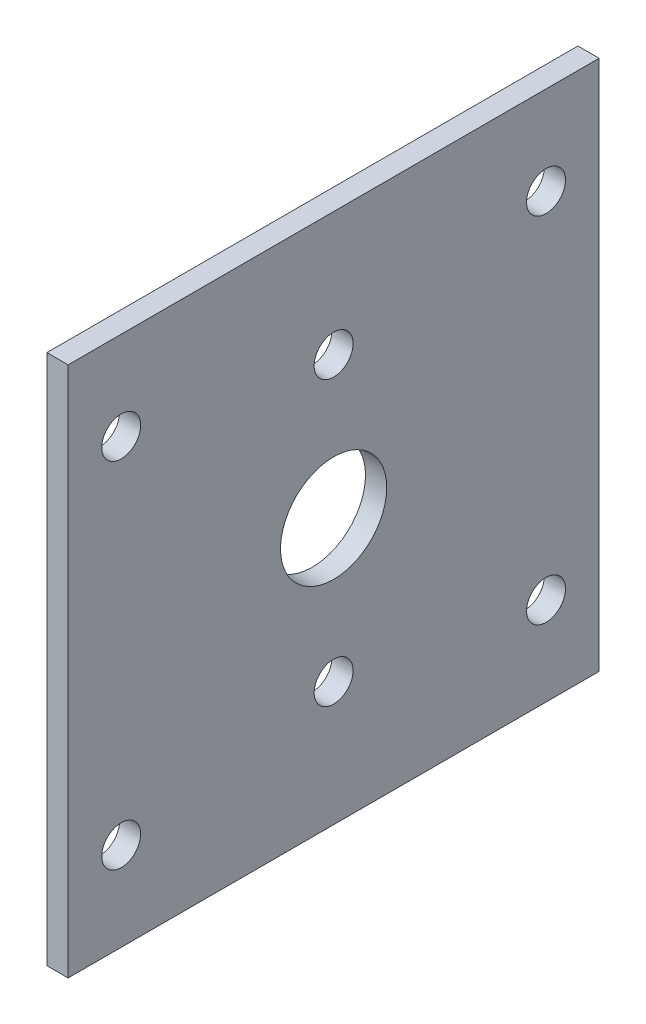
ISO-10303-21;
HEADER;
FILE_DESCRIPTION(('STEP AP214'),'2;1');
FILE_NAME('part.step','',(''),(''),'','','');
FILE_SCHEMA(('AUTOMOTIVE_DESIGN { 1 0 10303 214 1 1 1 1 }'));
ENDSEC;
DATA;
#1=APPLICATION_CONTEXT('core data for automotive mechanical design processes');
#2=APPLICATION_PROTOCOL_DEFINITION('international standard','automotive_design',2000,#1);
#3=PRODUCT_CONTEXT('',#1,'mechanical');
#4=PRODUCT('Part','Part','',(#3));
#5=PRODUCT_RELATED_PRODUCT_CATEGORY('part','',(#4));
#6=PRODUCT_DEFINITION_FORMATION('','',#4);
#7=PRODUCT_DEFINITION_CONTEXT('part definition',#1,'design');
#8=PRODUCT_DEFINITION('design','',#6,#7);
#9=PRODUCT_DEFINITION_SHAPE('','',#8);
#10=(LENGTH_UNIT() NAMED_UNIT(*) SI_UNIT(.MILLI.,.METRE.));
#11=(NAMED_UNIT(*) PLANE_ANGLE_UNIT() SI_UNIT($,.RADIAN.));
#12=(NAMED_UNIT(*) SI_UNIT($,.STERADIAN.) SOLID_ANGLE_UNIT());
#13=UNCERTAINTY_MEASURE_WITH_UNIT(LENGTH_MEASURE(1.E-05),#10,'distance_accuracy_value','');
#14=(GEOMETRIC_REPRESENTATION_CONTEXT(3) GLOBAL_UNCERTAINTY_ASSIGNED_CONTEXT((#13)) GLOBAL_UNIT_ASSIGNED_CONTEXT((#10,
#11,#12)) REPRESENTATION_CONTEXT('',''));
#15=CARTESIAN_POINT('',(0.,0.,0.));
#16=DIRECTION('',(0.,0.,1.));
#17=DIRECTION('',(1.,0.,0.));
#18=AXIS2_PLACEMENT_3D('',#15,#16,#17);
#19=CARTESIAN_POINT('',(3.,0.,0.));
#20=DIRECTION('',(-1.,0.,0.));
#21=DIRECTION('',(0.,0.,1.));
#22=AXIS2_PLACEMENT_3D('',#19,#20,#21);
#23=PLANE('',#22);
#24=DIRECTION('',(0.,1.,0.));
#25=VECTOR('',#24,1.);
#26=CARTESIAN_POINT('',(3.,107.5,-87.4999999999999));
#27=LINE('',#26,#25);
#28=CARTESIAN_POINT('',(3.,107.5,-87.4999999999999));
#29=VERTEX_POINT('',#28);
#30=CARTESIAN_POINT('',(3.,182.5,-87.4999999999999));
#31=VERTEX_POINT('',#30);
#32=EDGE_CURVE('E89',#29,#31,#27,.T.);
#33=ORIENTED_EDGE('',*,*,#32,.T.);
#34=DIRECTION('',(0.,0.,1.));
#35=VECTOR('',#34,1.);
#36=CARTESIAN_POINT('',(3.,182.5,-12.4999999999999));
#37=LINE('',#36,#35);
#38=CARTESIAN_POINT('',(3.,182.5,-12.4999999999999));
#39=VERTEX_POINT('',#38);
#40=EDGE_CURVE('E84',#31,#39,#37,.T.);
#41=ORIENTED_EDGE('',*,*,#40,.T.);
#42=DIRECTION('',(0.,-1.,0.));
#43=VECTOR('',#42,1.);
#44=CARTESIAN_POINT('',(3.,107.5,-12.4999999999999));
#45=LINE('',#44,#43);
#46=CARTESIAN_POINT('',(3.,107.5,-12.4999999999999));
#47=VERTEX_POINT('',#46);
#48=EDGE_CURVE('E87',#39,#47,#45,.T.);
#49=ORIENTED_EDGE('',*,*,#48,.T.);
#50=DIRECTION('',(0.,0.,-1.));
#51=VECTOR('',#50,1.);
#52=CARTESIAN_POINT('',(3.,107.5,-12.4999999999999));
#53=LINE('',#52,#51);
#54=EDGE_CURVE('E54',#47,#29,#53,.T.);
#55=ORIENTED_EDGE('',*,*,#54,.T.);
#56=EDGE_LOOP('',(#33,#41,#49,#55));
#57=FACE_BOUND('',#56,.T.);
#58=CARTESIAN_POINT('',(3.,145.,-50.));
#59=DIRECTION('',(1.,0.,0.));
#60=DIRECTION('',(0.,0.,-1.));
#61=AXIS2_PLACEMENT_3D('',#58,#59,#60);
#62=CIRCLE('',#61,7.5);
#63=CARTESIAN_POINT('',(3.,145.,-57.5));
#64=VERTEX_POINT('',#63);
#65=EDGE_CURVE('E104',#64,#64,#62,.T.);
#66=ORIENTED_EDGE('',*,*,#65,.F.);
#67=EDGE_LOOP('',(#66));
#68=FACE_BOUND('',#67,.T.);
#69=CARTESIAN_POINT('',(3.,165.,-50.));
#70=DIRECTION('',(1.,0.,0.));
#71=DIRECTION('',(0.,0.,-1.));
#72=AXIS2_PLACEMENT_3D('',#69,#70,#71);
#73=CIRCLE('',#72,2.75);
#74=CARTESIAN_POINT('',(3.,165.,-52.75));
#75=VERTEX_POINT('',#74);
#76=EDGE_CURVE('E119',#75,#75,#73,.T.);
#77=ORIENTED_EDGE('',*,*,#76,.F.);
#78=EDGE_LOOP('',(#77));
#79=FACE_BOUND('',#78,.T.);
#80=CARTESIAN_POINT('',(3.,170.,-19.9999999999999));
#81=DIRECTION('',(1.,0.,0.));
#82=DIRECTION('',(0.,0.,-1.));
#83=AXIS2_PLACEMENT_3D('',#80,#81,#82);
#84=CIRCLE('',#83,2.75000000000001);
#85=CARTESIAN_POINT('',(3.,170.,-22.75));
#86=VERTEX_POINT('',#85);
#87=EDGE_CURVE('E125',#86,#86,#84,.T.);
#88=ORIENTED_EDGE('',*,*,#87,.F.);
#89=EDGE_LOOP('',(#88));
#90=FACE_BOUND('',#89,.T.);
#91=CARTESIAN_POINT('',(3.,170.,-80.));
#92=DIRECTION('',(1.,0.,0.));
#93=DIRECTION('',(0.,0.,-1.));
#94=AXIS2_PLACEMENT_3D('',#91,#92,#93);
#95=CIRCLE('',#94,2.75);
#96=CARTESIAN_POINT('',(3.,170.,-82.75));
#97=VERTEX_POINT('',#96);
#98=EDGE_CURVE('E131',#97,#97,#95,.T.);
#99=ORIENTED_EDGE('',*,*,#98,.F.);
#100=EDGE_LOOP('',(#99));
#101=FACE_BOUND('',#100,.T.);
#102=CARTESIAN_POINT('',(3.,120.,-80.));
#103=DIRECTION('',(1.,0.,0.));
#104=DIRECTION('',(0.,0.,-1.));
#105=AXIS2_PLACEMENT_3D('',#102,#103,#104);
#106=CIRCLE('',#105,2.75000000000001);
#107=CARTESIAN_POINT('',(3.,120.,-82.75));
#108=VERTEX_POINT('',#107);
#109=EDGE_CURVE('E137',#108,#108,#106,.T.);
#110=ORIENTED_EDGE('',*,*,#109,.F.);
#111=EDGE_LOOP('',(#110));
#112=FACE_BOUND('',#111,.T.);
#113=CARTESIAN_POINT('',(3.,120.,-19.9999999999999));
#114=DIRECTION('',(1.,0.,0.));
#115=DIRECTION('',(0.,0.,-1.));
#116=AXIS2_PLACEMENT_3D('',#113,#114,#115);
#117=CIRCLE('',#116,2.75);
#118=CARTESIAN_POINT('',(3.,120.,-22.7499999999999));
#119=VERTEX_POINT('',#118);
#120=EDGE_CURVE('E143',#119,#119,#117,.T.);
#121=ORIENTED_EDGE('',*,*,#120,.F.);
#122=EDGE_LOOP('',(#121));
#123=FACE_BOUND('',#122,.T.);
#124=CARTESIAN_POINT('',(3.,125.,-50.));
#125=DIRECTION('',(1.,0.,0.));
#126=DIRECTION('',(0.,0.,-1.));
#127=AXIS2_PLACEMENT_3D('',#124,#125,#126);
#128=CIRCLE('',#127,2.75);
#129=CARTESIAN_POINT('',(3.,125.,-52.75));
#130=VERTEX_POINT('',#129);
#131=EDGE_CURVE('E149',#130,#130,#128,.T.);
#132=ORIENTED_EDGE('',*,*,#131,.F.);
#133=EDGE_LOOP('',(#132));
#134=FACE_BOUND('',#133,.T.);
#135=ADVANCED_FACE('F37',(#57,#68,#79,#90,#101,#112,#123,#134),#23,.F.);
#136=CARTESIAN_POINT('',(0.,0.,0.));
#137=DIRECTION('',(-1.,0.,0.));
#138=DIRECTION('',(0.,0.,1.));
#139=AXIS2_PLACEMENT_3D('',#136,#137,#138);
#140=PLANE('',#139);
#141=CARTESIAN_POINT('',(0.,120.,-19.9999999999999));
#142=DIRECTION('',(1.,0.,0.));
#143=DIRECTION('',(0.,0.,-1.));
#144=AXIS2_PLACEMENT_3D('',#141,#142,#143);
#145=CIRCLE('',#144,2.75);
#146=CARTESIAN_POINT('',(0.,120.,-22.7499999999999));
#147=VERTEX_POINT('',#146);
#148=EDGE_CURVE('E146',#147,#147,#145,.T.);
#149=ORIENTED_EDGE('',*,*,#148,.T.);
#150=EDGE_LOOP('',(#149));
#151=FACE_BOUND('',#150,.T.);
#152=CARTESIAN_POINT('',(0.,170.,-80.));
#153=DIRECTION('',(1.,0.,0.));
#154=DIRECTION('',(0.,0.,-1.));
#155=AXIS2_PLACEMENT_3D('',#152,#153,#154);
#156=CIRCLE('',#155,2.75);
#157=CARTESIAN_POINT('',(0.,170.,-82.75));
#158=VERTEX_POINT('',#157);
#159=EDGE_CURVE('E134',#158,#158,#156,.T.);
#160=ORIENTED_EDGE('',*,*,#159,.T.);
#161=EDGE_LOOP('',(#160));
#162=FACE_BOUND('',#161,.T.);
#163=CARTESIAN_POINT('',(0.,165.,-50.));
#164=DIRECTION('',(1.,0.,0.));
#165=DIRECTION('',(0.,0.,-1.));
#166=AXIS2_PLACEMENT_3D('',#163,#164,#165);
#167=CIRCLE('',#166,2.75);
#168=CARTESIAN_POINT('',(0.,165.,-52.75));
#169=VERTEX_POINT('',#168);
#170=EDGE_CURVE('E122',#169,#169,#167,.T.);
#171=ORIENTED_EDGE('',*,*,#170,.T.);
#172=EDGE_LOOP('',(#171));
#173=FACE_BOUND('',#172,.T.);
#174=DIRECTION('',(0.,1.,0.));
#175=VECTOR('',#174,1.);
#176=CARTESIAN_POINT('',(0.,107.5,-87.4999999999999));
#177=LINE('',#176,#175);
#178=CARTESIAN_POINT('',(0.,107.5,-87.4999999999999));
#179=VERTEX_POINT('',#178);
#180=CARTESIAN_POINT('',(0.,182.5,-87.4999999999999));
#181=VERTEX_POINT('',#180);
#182=EDGE_CURVE('E101',#179,#181,#177,.T.);
#183=ORIENTED_EDGE('',*,*,#182,.F.);
#184=DIRECTION('',(0.,0.,-1.));
#185=VECTOR('',#184,1.);
#186=CARTESIAN_POINT('',(0.,107.5,-12.4999999999999));
#187=LINE('',#186,#185);
#188=CARTESIAN_POINT('',(0.,107.5,-12.4999999999999));
#189=VERTEX_POINT('',#188);
#190=EDGE_CURVE('E77',#189,#179,#187,.T.);
#191=ORIENTED_EDGE('',*,*,#190,.F.);
#192=DIRECTION('',(0.,-1.,0.));
#193=VECTOR('',#192,1.);
#194=CARTESIAN_POINT('',(0.,107.5,-12.4999999999999));
#195=LINE('',#194,#193);
#196=CARTESIAN_POINT('',(0.,182.5,-12.4999999999999));
#197=VERTEX_POINT('',#196);
#198=EDGE_CURVE('E71',#197,#189,#195,.T.);
#199=ORIENTED_EDGE('',*,*,#198,.F.);
#200=DIRECTION('',(0.,0.,1.));
#201=VECTOR('',#200,1.);
#202=CARTESIAN_POINT('',(0.,182.5,-12.4999999999999));
#203=LINE('',#202,#201);
#204=EDGE_CURVE('E93',#181,#197,#203,.T.);
#205=ORIENTED_EDGE('',*,*,#204,.F.);
#206=EDGE_LOOP('',(#183,#191,#199,#205));
#207=FACE_BOUND('',#206,.T.);
#208=CARTESIAN_POINT('',(0.,145.,-50.));
#209=DIRECTION('',(1.,0.,0.));
#210=DIRECTION('',(0.,0.,-1.));
#211=AXIS2_PLACEMENT_3D('',#208,#209,#210);
#212=CIRCLE('',#211,7.5);
#213=CARTESIAN_POINT('',(0.,145.,-57.5));
#214=VERTEX_POINT('',#213);
#215=EDGE_CURVE('E116',#214,#214,#212,.T.);
#216=ORIENTED_EDGE('',*,*,#215,.T.);
#217=EDGE_LOOP('',(#216));
#218=FACE_BOUND('',#217,.T.);
#219=CARTESIAN_POINT('',(0.,170.,-19.9999999999999));
#220=DIRECTION('',(1.,0.,0.));
#221=DIRECTION('',(0.,0.,-1.));
#222=AXIS2_PLACEMENT_3D('',#219,#220,#221);
#223=CIRCLE('',#222,2.75000000000001);
#224=CARTESIAN_POINT('',(0.,170.,-22.75));
#225=VERTEX_POINT('',#224);
#226=EDGE_CURVE('E128',#225,#225,#223,.T.);
#227=ORIENTED_EDGE('',*,*,#226,.T.);
#228=EDGE_LOOP('',(#227));
#229=FACE_BOUND('',#228,.T.);
#230=CARTESIAN_POINT('',(0.,120.,-80.));
#231=DIRECTION('',(1.,0.,0.));
#232=DIRECTION('',(0.,0.,-1.));
#233=AXIS2_PLACEMENT_3D('',#230,#231,#232);
#234=CIRCLE('',#233,2.75000000000001);
#235=CARTESIAN_POINT('',(0.,120.,-82.75));
#236=VERTEX_POINT('',#235);
#237=EDGE_CURVE('E140',#236,#236,#234,.T.);
#238=ORIENTED_EDGE('',*,*,#237,.T.);
#239=EDGE_LOOP('',(#238));
#240=FACE_BOUND('',#239,.T.);
#241=CARTESIAN_POINT('',(0.,125.,-50.));
#242=DIRECTION('',(1.,0.,0.));
#243=DIRECTION('',(0.,0.,-1.));
#244=AXIS2_PLACEMENT_3D('',#241,#242,#243);
#245=CIRCLE('',#244,2.75);
#246=CARTESIAN_POINT('',(0.,125.,-52.75));
#247=VERTEX_POINT('',#246);
#248=EDGE_CURVE('E152',#247,#247,#245,.T.);
#249=ORIENTED_EDGE('',*,*,#248,.T.);
#250=EDGE_LOOP('',(#249));
#251=FACE_BOUND('',#250,.T.);
#252=ADVANCED_FACE('F112',(#151,#162,#173,#207,#218,#229,#240,#251),#140,.T.);
#253=CARTESIAN_POINT('',(3.,107.5,-87.4999999999999));
#254=DIRECTION('',(0.,0.,1.));
#255=DIRECTION('',(1.,0.,0.));
#256=AXIS2_PLACEMENT_3D('',#253,#254,#255);
#257=PLANE('',#256);
#258=ORIENTED_EDGE('',*,*,#182,.T.);
#259=DIRECTION('',(-1.,0.,0.));
#260=VECTOR('',#259,1.);
#261=CARTESIAN_POINT('',(3.,182.5,-87.4999999999999));
#262=LINE('',#261,#260);
#263=EDGE_CURVE('E11',#31,#181,#262,.T.);
#264=ORIENTED_EDGE('',*,*,#263,.F.);
#265=ORIENTED_EDGE('',*,*,#32,.F.);
#266=DIRECTION('',(-1.,0.,0.));
#267=VECTOR('',#266,1.);
#268=CARTESIAN_POINT('',(3.,107.5,-87.4999999999999));
#269=LINE('',#268,#267);
#270=EDGE_CURVE('E97',#29,#179,#269,.T.);
#271=ORIENTED_EDGE('',*,*,#270,.T.);
#272=EDGE_LOOP('',(#258,#264,#265,#271));
#273=FACE_BOUND('',#272,.T.);
#274=ADVANCED_FACE('F39',(#273),#257,.F.);
#275=CARTESIAN_POINT('',(3.,182.5,-12.4999999999999));
#276=DIRECTION('',(0.,-1.,0.));
#277=DIRECTION('',(0.,0.,-1.));
#278=AXIS2_PLACEMENT_3D('',#275,#276,#277);
#279=PLANE('',#278);
#280=ORIENTED_EDGE('',*,*,#204,.T.);
#281=DIRECTION('',(-1.,0.,0.));
#282=VECTOR('',#281,1.);
#283=CARTESIAN_POINT('',(3.,182.5,-12.4999999999999));
#284=LINE('',#283,#282);
#285=EDGE_CURVE('E46',#39,#197,#284,.T.);
#286=ORIENTED_EDGE('',*,*,#285,.F.);
#287=ORIENTED_EDGE('',*,*,#40,.F.);
#288=ORIENTED_EDGE('',*,*,#263,.T.);
#289=EDGE_LOOP('',(#280,#286,#287,#288));
#290=FACE_BOUND('',#289,.T.);
#291=ADVANCED_FACE('F92',(#290),#279,.F.);
#292=CARTESIAN_POINT('',(3.,107.5,-12.4999999999999));
#293=DIRECTION('',(0.,0.,-1.));
#294=DIRECTION('',(-1.,0.,0.));
#295=AXIS2_PLACEMENT_3D('',#292,#293,#294);
#296=PLANE('',#295);
#297=ORIENTED_EDGE('',*,*,#198,.T.);
#298=DIRECTION('',(-1.,0.,0.));
#299=VECTOR('',#298,1.);
#300=CARTESIAN_POINT('',(3.,107.5,-12.4999999999999));
#301=LINE('',#300,#299);
#302=EDGE_CURVE('E94',#47,#189,#301,.T.);
#303=ORIENTED_EDGE('',*,*,#302,.F.);
#304=ORIENTED_EDGE('',*,*,#48,.F.);
#305=ORIENTED_EDGE('',*,*,#285,.T.);
#306=EDGE_LOOP('',(#297,#303,#304,#305));
#307=FACE_BOUND('',#306,.T.);
#308=ADVANCED_FACE('F95',(#307),#296,.F.);
#309=CARTESIAN_POINT('',(3.,107.5,-12.4999999999999));
#310=DIRECTION('',(0.,1.,0.));
#311=DIRECTION('',(0.,0.,1.));
#312=AXIS2_PLACEMENT_3D('',#309,#310,#311);
#313=PLANE('',#312);
#314=ORIENTED_EDGE('',*,*,#190,.T.);
#315=ORIENTED_EDGE('',*,*,#270,.F.);
#316=ORIENTED_EDGE('',*,*,#54,.F.);
#317=ORIENTED_EDGE('',*,*,#302,.T.);
#318=EDGE_LOOP('',(#314,#315,#316,#317));
#319=FACE_BOUND('',#318,.T.);
#320=ADVANCED_FACE('F109',(#319),#313,.F.);
#321=CARTESIAN_POINT('',(3.,145.,-50.));
#322=DIRECTION('',(-1.,0.,0.));
#323=DIRECTION('',(0.,0.,1.));
#324=AXIS2_PLACEMENT_3D('',#321,#322,#323);
#325=CYLINDRICAL_SURFACE('',#324,7.5);
#326=ORIENTED_EDGE('',*,*,#65,.T.);
#327=EDGE_LOOP('',(#326));
#328=FACE_BOUND('',#327,.T.);
#329=ORIENTED_EDGE('',*,*,#215,.F.);
#330=EDGE_LOOP('',(#329));
#331=FACE_BOUND('',#330,.T.);
#332=ADVANCED_FACE('F169',(#328,#331),#325,.F.);
#333=CARTESIAN_POINT('',(3.,165.,-50.));
#334=DIRECTION('',(-1.,0.,0.));
#335=DIRECTION('',(0.,0.,1.));
#336=AXIS2_PLACEMENT_3D('',#333,#334,#335);
#337=CYLINDRICAL_SURFACE('',#336,2.75);
#338=ORIENTED_EDGE('',*,*,#76,.T.);
#339=EDGE_LOOP('',(#338));
#340=FACE_BOUND('',#339,.T.);
#341=ORIENTED_EDGE('',*,*,#170,.F.);
#342=EDGE_LOOP('',(#341));
#343=FACE_BOUND('',#342,.T.);
#344=ADVANCED_FACE('F223',(#340,#343),#337,.F.);
#345=CARTESIAN_POINT('',(3.,170.,-19.9999999999999));
#346=DIRECTION('',(-1.,0.,0.));
#347=DIRECTION('',(0.,0.,1.));
#348=AXIS2_PLACEMENT_3D('',#345,#346,#347);
#349=CYLINDRICAL_SURFACE('',#348,2.75000000000001);
#350=ORIENTED_EDGE('',*,*,#87,.T.);
#351=EDGE_LOOP('',(#350));
#352=FACE_BOUND('',#351,.T.);
#353=ORIENTED_EDGE('',*,*,#226,.F.);
#354=EDGE_LOOP('',(#353));
#355=FACE_BOUND('',#354,.T.);
#356=ADVANCED_FACE('F232',(#352,#355),#349,.F.);
#357=CARTESIAN_POINT('',(3.,170.,-80.));
#358=DIRECTION('',(-1.,0.,0.));
#359=DIRECTION('',(0.,0.,1.));
#360=AXIS2_PLACEMENT_3D('',#357,#358,#359);
#361=CYLINDRICAL_SURFACE('',#360,2.75);
#362=ORIENTED_EDGE('',*,*,#98,.T.);
#363=EDGE_LOOP('',(#362));
#364=FACE_BOUND('',#363,.T.);
#365=ORIENTED_EDGE('',*,*,#159,.F.);
#366=EDGE_LOOP('',(#365));
#367=FACE_BOUND('',#366,.T.);
#368=ADVANCED_FACE('F241',(#364,#367),#361,.F.);
#369=CARTESIAN_POINT('',(3.,120.,-80.));
#370=DIRECTION('',(-1.,0.,0.));
#371=DIRECTION('',(0.,0.,1.));
#372=AXIS2_PLACEMENT_3D('',#369,#370,#371);
#373=CYLINDRICAL_SURFACE('',#372,2.75000000000001);
#374=ORIENTED_EDGE('',*,*,#109,.T.);
#375=EDGE_LOOP('',(#374));
#376=FACE_BOUND('',#375,.T.);
#377=ORIENTED_EDGE('',*,*,#237,.F.);
#378=EDGE_LOOP('',(#377));
#379=FACE_BOUND('',#378,.T.);
#380=ADVANCED_FACE('F251',(#376,#379),#373,.F.);
#381=CARTESIAN_POINT('',(3.,120.,-19.9999999999999));
#382=DIRECTION('',(-1.,0.,0.));
#383=DIRECTION('',(0.,0.,1.));
#384=AXIS2_PLACEMENT_3D('',#381,#382,#383);
#385=CYLINDRICAL_SURFACE('',#384,2.75);
#386=ORIENTED_EDGE('',*,*,#120,.T.);
#387=EDGE_LOOP('',(#386));
#388=FACE_BOUND('',#387,.T.);
#389=ORIENTED_EDGE('',*,*,#148,.F.);
#390=EDGE_LOOP('',(#389));
#391=FACE_BOUND('',#390,.T.);
#392=ADVANCED_FACE('F261',(#388,#391),#385,.F.);
#393=CARTESIAN_POINT('',(3.,125.,-50.));
#394=DIRECTION('',(-1.,0.,0.));
#395=DIRECTION('',(0.,0.,1.));
#396=AXIS2_PLACEMENT_3D('',#393,#394,#395);
#397=CYLINDRICAL_SURFACE('',#396,2.75);
#398=ORIENTED_EDGE('',*,*,#131,.T.);
#399=EDGE_LOOP('',(#398));
#400=FACE_BOUND('',#399,.T.);
#401=ORIENTED_EDGE('',*,*,#248,.F.);
#402=EDGE_LOOP('',(#401));
#403=FACE_BOUND('',#402,.T.);
#404=ADVANCED_FACE('F158',(#400,#403),#397,.F.);
#405=CLOSED_SHELL('',(#135,#252,#274,#291,#308,#320,#332,#344,#356,#368,#380,#392,#404));
#406=MANIFOLD_SOLID_BREP('B2',#405);
#407=ADVANCED_BREP_SHAPE_REPRESENTATION('',(#18,#406),#14);
#408=SHAPE_DEFINITION_REPRESENTATION(#9,#407);
ENDSEC;
END-ISO-10303-21;
